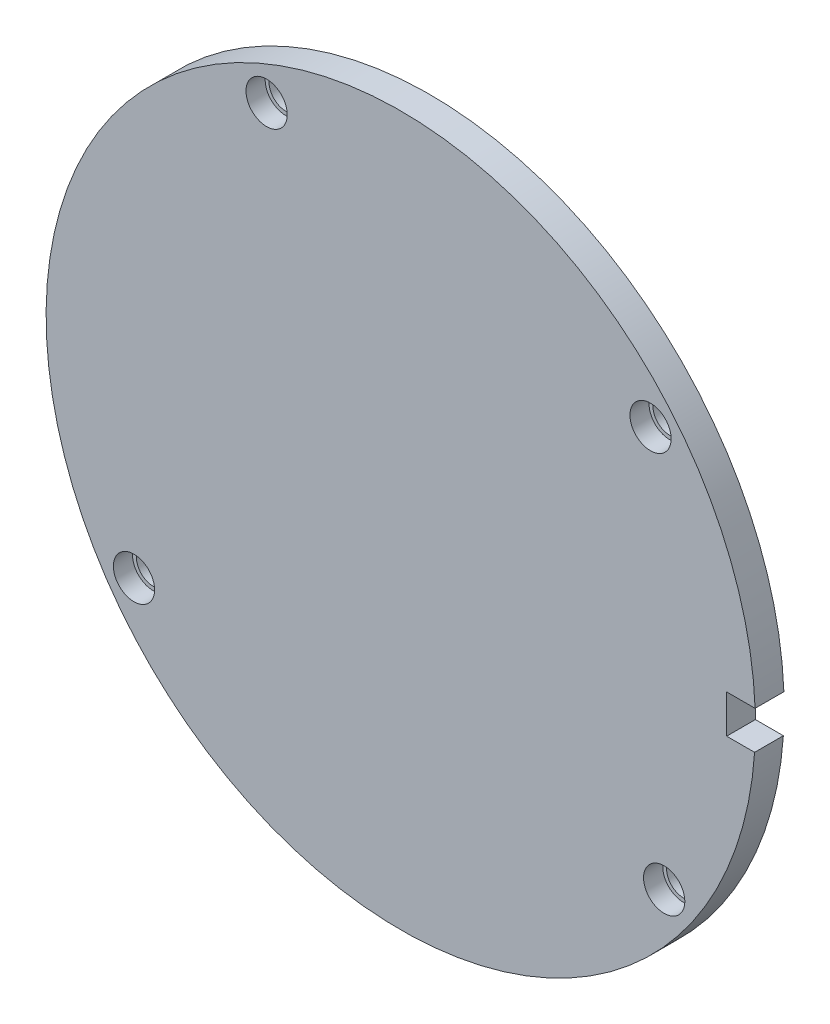
ISO-10303-21;
HEADER;
FILE_DESCRIPTION(('STEP AP214'),'2;1');
FILE_NAME('part.step','',(''),(''),'','','');
FILE_SCHEMA(('AUTOMOTIVE_DESIGN { 1 0 10303 214 1 1 1 1 }'));
ENDSEC;
DATA;
#1=APPLICATION_CONTEXT('core data for automotive mechanical design processes');
#2=APPLICATION_PROTOCOL_DEFINITION('international standard','automotive_design',2000,#1);
#3=PRODUCT_CONTEXT('',#1,'mechanical');
#4=PRODUCT('Part','Part','',(#3));
#5=PRODUCT_RELATED_PRODUCT_CATEGORY('part','',(#4));
#6=PRODUCT_DEFINITION_FORMATION('','',#4);
#7=PRODUCT_DEFINITION_CONTEXT('part definition',#1,'design');
#8=PRODUCT_DEFINITION('design','',#6,#7);
#9=PRODUCT_DEFINITION_SHAPE('','',#8);
#10=(LENGTH_UNIT() NAMED_UNIT(*) SI_UNIT(.MILLI.,.METRE.));
#11=(NAMED_UNIT(*) PLANE_ANGLE_UNIT() SI_UNIT($,.RADIAN.));
#12=(NAMED_UNIT(*) SI_UNIT($,.STERADIAN.) SOLID_ANGLE_UNIT());
#13=UNCERTAINTY_MEASURE_WITH_UNIT(LENGTH_MEASURE(1.E-05),#10,'distance_accuracy_value','');
#14=(GEOMETRIC_REPRESENTATION_CONTEXT(3) GLOBAL_UNCERTAINTY_ASSIGNED_CONTEXT((#13)) GLOBAL_UNIT_ASSIGNED_CONTEXT((#10,
#11,#12)) REPRESENTATION_CONTEXT('',''));
#15=CARTESIAN_POINT('',(0.,0.,0.));
#16=DIRECTION('',(0.,0.,1.));
#17=DIRECTION('',(1.,0.,0.));
#18=AXIS2_PLACEMENT_3D('',#15,#16,#17);
#19=CARTESIAN_POINT('',(0.,0.,-6.2));
#20=DIRECTION('',(0.,0.,1.));
#21=DIRECTION('',(1.,0.,0.));
#22=AXIS2_PLACEMENT_3D('',#19,#20,#21);
#23=CYLINDRICAL_SURFACE('',#22,18.5);
#24=CARTESIAN_POINT('',(0.,0.,0.));
#25=DIRECTION('',(0.,0.,-1.));
#26=DIRECTION('',(-1.,0.,0.));
#27=AXIS2_PLACEMENT_3D('',#24,#25,#26);
#28=CIRCLE('',#27,18.5);
#29=CARTESIAN_POINT('',(18.4578220201208,-1.24852163519195,0.));
#30=VERTEX_POINT('',#29);
#31=CARTESIAN_POINT('',(18.4847310033775,0.751478364808046,0.));
#32=VERTEX_POINT('',#31);
#33=EDGE_CURVE('E52',#30,#32,#28,.T.);
#34=ORIENTED_EDGE('',*,*,#33,.T.);
#35=DIRECTION('',(0.,0.,1.));
#36=VECTOR('',#35,1.);
#37=CARTESIAN_POINT('',(18.4847310033775,0.751478364808046,-6.2));
#38=LINE('',#37,#36);
#39=CARTESIAN_POINT('',(18.4847310033775,0.751478364808046,-1.5));
#40=VERTEX_POINT('',#39);
#41=EDGE_CURVE('E66',#32,#40,#38,.F.);
#42=ORIENTED_EDGE('',*,*,#41,.T.);
#43=CARTESIAN_POINT('',(0.,0.,-1.5));
#44=DIRECTION('',(0.,0.,-1.));
#45=DIRECTION('',(-1.,0.,0.));
#46=AXIS2_PLACEMENT_3D('',#43,#44,#45);
#47=CIRCLE('',#46,18.5);
#48=CARTESIAN_POINT('',(18.4578220201208,-1.24852163519195,-1.5));
#49=VERTEX_POINT('',#48);
#50=EDGE_CURVE('E149',#49,#40,#47,.T.);
#51=ORIENTED_EDGE('',*,*,#50,.F.);
#52=DIRECTION('',(0.,0.,1.));
#53=VECTOR('',#52,1.);
#54=CARTESIAN_POINT('',(18.4578220201208,-1.24852163519195,-6.2));
#55=LINE('',#54,#53);
#56=EDGE_CURVE('E58',#49,#30,#55,.T.);
#57=ORIENTED_EDGE('',*,*,#56,.T.);
#58=EDGE_LOOP('',(#34,#42,#51,#57));
#59=FACE_BOUND('',#58,.T.);
#60=ADVANCED_FACE('F45',(#59),#23,.T.);
#61=CARTESIAN_POINT('',(13.0293023175447,10.7348628830565,-6.2));
#62=DIRECTION('',(0.,0.,1.));
#63=DIRECTION('',(1.,0.,0.));
#64=AXIS2_PLACEMENT_3D('',#61,#62,#63);
#65=CYLINDRICAL_SURFACE('',#64,0.875);
#66=CARTESIAN_POINT('',(13.0293023175447,10.7348628830565,-1.));
#67=DIRECTION('',(0.,0.,-1.));
#68=DIRECTION('',(-1.,0.,0.));
#69=AXIS2_PLACEMENT_3D('',#66,#67,#68);
#70=CIRCLE('',#69,0.875);
#71=CARTESIAN_POINT('',(12.1543023175447,10.7348628830565,-1.));
#72=VERTEX_POINT('',#71);
#73=EDGE_CURVE('E155',#72,#72,#70,.T.);
#74=ORIENTED_EDGE('',*,*,#73,.F.);
#75=EDGE_LOOP('',(#74));
#76=FACE_BOUND('',#75,.T.);
#77=CARTESIAN_POINT('',(13.0293023175447,10.7348628830565,-1.5));
#78=DIRECTION('',(0.,0.,-1.));
#79=DIRECTION('',(-1.,0.,0.));
#80=AXIS2_PLACEMENT_3D('',#77,#78,#79);
#81=CIRCLE('',#80,0.875);
#82=CARTESIAN_POINT('',(12.1543023175447,10.7348628830565,-1.5));
#83=VERTEX_POINT('',#82);
#84=EDGE_CURVE('E146',#83,#83,#81,.T.);
#85=ORIENTED_EDGE('',*,*,#84,.T.);
#86=EDGE_LOOP('',(#85));
#87=FACE_BOUND('',#86,.T.);
#88=ADVANCED_FACE('F169',(#76,#87),#65,.F.);
#89=CARTESIAN_POINT('',(-6.99684971623732,15.3637265677436,-6.2));
#90=DIRECTION('',(0.,0.,1.));
#91=DIRECTION('',(1.,0.,0.));
#92=AXIS2_PLACEMENT_3D('',#89,#90,#91);
#93=CYLINDRICAL_SURFACE('',#92,0.874999999999999);
#94=CARTESIAN_POINT('',(-6.99684971623732,15.3637265677436,-1.));
#95=DIRECTION('',(0.,0.,-1.));
#96=DIRECTION('',(-1.,0.,0.));
#97=AXIS2_PLACEMENT_3D('',#94,#95,#96);
#98=CIRCLE('',#97,0.874999999999999);
#99=CARTESIAN_POINT('',(-7.87184971623732,15.3637265677436,-1.));
#100=VERTEX_POINT('',#99);
#101=EDGE_CURVE('E161',#100,#100,#98,.T.);
#102=ORIENTED_EDGE('',*,*,#101,.F.);
#103=EDGE_LOOP('',(#102));
#104=FACE_BOUND('',#103,.T.);
#105=CARTESIAN_POINT('',(-6.99684971623732,15.3637265677436,-1.5));
#106=DIRECTION('',(0.,0.,-1.));
#107=DIRECTION('',(-1.,0.,0.));
#108=AXIS2_PLACEMENT_3D('',#105,#106,#107);
#109=CIRCLE('',#108,0.874999999999999);
#110=CARTESIAN_POINT('',(-7.87184971623732,15.3637265677436,-1.5));
#111=VERTEX_POINT('',#110);
#112=EDGE_CURVE('E142',#111,#111,#109,.T.);
#113=ORIENTED_EDGE('',*,*,#112,.T.);
#114=EDGE_LOOP('',(#113));
#115=FACE_BOUND('',#114,.T.);
#116=ADVANCED_FACE('F172',(#104,#115),#93,.F.);
#117=CARTESIAN_POINT('',(13.7413128845952,-9.80695264634526,-6.2));
#118=DIRECTION('',(0.,0.,1.));
#119=DIRECTION('',(1.,0.,0.));
#120=AXIS2_PLACEMENT_3D('',#117,#118,#119);
#121=CYLINDRICAL_SURFACE('',#120,0.875);
#122=CARTESIAN_POINT('',(13.7413128845952,-9.80695264634526,-1.));
#123=DIRECTION('',(0.,0.,-1.));
#124=DIRECTION('',(-1.,0.,0.));
#125=AXIS2_PLACEMENT_3D('',#122,#123,#124);
#126=CIRCLE('',#125,0.875);
#127=CARTESIAN_POINT('',(12.8663128845952,-9.80695264634526,-1.));
#128=VERTEX_POINT('',#127);
#129=EDGE_CURVE('E158',#128,#128,#126,.T.);
#130=ORIENTED_EDGE('',*,*,#129,.F.);
#131=EDGE_LOOP('',(#130));
#132=FACE_BOUND('',#131,.T.);
#133=CARTESIAN_POINT('',(13.7413128845952,-9.80695264634526,-1.5));
#134=DIRECTION('',(0.,0.,-1.));
#135=DIRECTION('',(-1.,0.,0.));
#136=AXIS2_PLACEMENT_3D('',#133,#134,#135);
#137=CIRCLE('',#136,0.875);
#138=CARTESIAN_POINT('',(12.8663128845952,-9.80695264634526,-1.5));
#139=VERTEX_POINT('',#138);
#140=EDGE_CURVE('E139',#139,#139,#137,.T.);
#141=ORIENTED_EDGE('',*,*,#140,.T.);
#142=EDGE_LOOP('',(#141));
#143=FACE_BOUND('',#142,.T.);
#144=ADVANCED_FACE('F240',(#132,#143),#121,.F.);
#145=CARTESIAN_POINT('',(-13.9153268364395,-9.55843496787351,-6.2));
#146=DIRECTION('',(0.,0.,1.));
#147=DIRECTION('',(1.,0.,0.));
#148=AXIS2_PLACEMENT_3D('',#145,#146,#147);
#149=CYLINDRICAL_SURFACE('',#148,0.875);
#150=CARTESIAN_POINT('',(-13.9153268364395,-9.55843496787351,-1.));
#151=DIRECTION('',(0.,0.,-1.));
#152=DIRECTION('',(-1.,0.,0.));
#153=AXIS2_PLACEMENT_3D('',#150,#151,#152);
#154=CIRCLE('',#153,0.875);
#155=CARTESIAN_POINT('',(-14.7903268364395,-9.55843496787351,-1.));
#156=VERTEX_POINT('',#155);
#157=EDGE_CURVE('E118',#156,#156,#154,.T.);
#158=ORIENTED_EDGE('',*,*,#157,.F.);
#159=EDGE_LOOP('',(#158));
#160=FACE_BOUND('',#159,.T.);
#161=CARTESIAN_POINT('',(-13.9153268364395,-9.55843496787351,-1.5));
#162=DIRECTION('',(0.,0.,-1.));
#163=DIRECTION('',(-1.,0.,0.));
#164=AXIS2_PLACEMENT_3D('',#161,#162,#163);
#165=CIRCLE('',#164,0.875);
#166=CARTESIAN_POINT('',(-14.7903268364395,-9.55843496787351,-1.5));
#167=VERTEX_POINT('',#166);
#168=EDGE_CURVE('E143',#167,#167,#165,.T.);
#169=ORIENTED_EDGE('',*,*,#168,.T.);
#170=EDGE_LOOP('',(#169));
#171=FACE_BOUND('',#170,.T.);
#172=ADVANCED_FACE('F187',(#160,#171),#149,.F.);
#173=CARTESIAN_POINT('',(0.,0.,0.));
#174=DIRECTION('',(0.,0.,-1.));
#175=DIRECTION('',(-1.,0.,0.));
#176=AXIS2_PLACEMENT_3D('',#173,#174,#175);
#177=PLANE('',#176);
#178=CARTESIAN_POINT('',(-13.9153268364395,-9.55843496787351,0.));
#179=DIRECTION('',(0.,0.,-1.));
#180=DIRECTION('',(-1.,0.,0.));
#181=AXIS2_PLACEMENT_3D('',#178,#179,#180);
#182=CIRCLE('',#181,1.075);
#183=CARTESIAN_POINT('',(-14.9903268364395,-9.55843496787351,0.));
#184=VERTEX_POINT('',#183);
#185=EDGE_CURVE('E119',#184,#184,#182,.T.);
#186=ORIENTED_EDGE('',*,*,#185,.T.);
#187=EDGE_LOOP('',(#186));
#188=FACE_BOUND('',#187,.T.);
#189=CARTESIAN_POINT('',(13.7413128845952,-9.80695264634526,0.));
#190=DIRECTION('',(0.,0.,-1.));
#191=DIRECTION('',(-1.,0.,0.));
#192=AXIS2_PLACEMENT_3D('',#189,#190,#191);
#193=CIRCLE('',#192,1.075);
#194=CARTESIAN_POINT('',(12.6663128845952,-9.80695264634526,0.));
#195=VERTEX_POINT('',#194);
#196=EDGE_CURVE('E122',#195,#195,#193,.T.);
#197=ORIENTED_EDGE('',*,*,#196,.T.);
#198=EDGE_LOOP('',(#197));
#199=FACE_BOUND('',#198,.T.);
#200=CARTESIAN_POINT('',(13.0293023175447,10.7348628830565,0.));
#201=DIRECTION('',(0.,0.,-1.));
#202=DIRECTION('',(-1.,0.,0.));
#203=AXIS2_PLACEMENT_3D('',#200,#201,#202);
#204=CIRCLE('',#203,1.075);
#205=CARTESIAN_POINT('',(11.9543023175447,10.7348628830565,0.));
#206=VERTEX_POINT('',#205);
#207=EDGE_CURVE('E128',#206,#206,#204,.T.);
#208=ORIENTED_EDGE('',*,*,#207,.T.);
#209=EDGE_LOOP('',(#208));
#210=FACE_BOUND('',#209,.T.);
#211=CARTESIAN_POINT('',(-6.99684971623732,15.3637265677436,0.));
#212=DIRECTION('',(0.,0.,-1.));
#213=DIRECTION('',(-1.,0.,0.));
#214=AXIS2_PLACEMENT_3D('',#211,#212,#213);
#215=CIRCLE('',#214,1.075);
#216=CARTESIAN_POINT('',(-8.07184971623732,15.3637265677436,0.));
#217=VERTEX_POINT('',#216);
#218=EDGE_CURVE('E134',#217,#217,#215,.T.);
#219=ORIENTED_EDGE('',*,*,#218,.T.);
#220=EDGE_LOOP('',(#219));
#221=FACE_BOUND('',#220,.T.);
#222=DIRECTION('',(0.,1.,0.));
#223=VECTOR('',#222,1.);
#224=CARTESIAN_POINT('',(17.,0.,0.));
#225=LINE('',#224,#223);
#226=CARTESIAN_POINT('',(17.,-1.24852163519195,0.));
#227=VERTEX_POINT('',#226);
#228=CARTESIAN_POINT('',(17.,0.751478364808046,0.));
#229=VERTEX_POINT('',#228);
#230=EDGE_CURVE('E92',#227,#229,#225,.T.);
#231=ORIENTED_EDGE('',*,*,#230,.T.);
#232=DIRECTION('',(1.,0.,0.));
#233=VECTOR('',#232,1.);
#234=CARTESIAN_POINT('',(0.,0.751478364808045,0.));
#235=LINE('',#234,#233);
#236=EDGE_CURVE('E111',#229,#32,#235,.T.);
#237=ORIENTED_EDGE('',*,*,#236,.T.);
#238=ORIENTED_EDGE('',*,*,#33,.F.);
#239=DIRECTION('',(-1.,0.,0.));
#240=VECTOR('',#239,1.);
#241=CARTESIAN_POINT('',(0.,-1.24852163519195,0.));
#242=LINE('',#241,#240);
#243=EDGE_CURVE('E106',#30,#227,#242,.T.);
#244=ORIENTED_EDGE('',*,*,#243,.T.);
#245=EDGE_LOOP('',(#231,#237,#238,#244));
#246=FACE_BOUND('',#245,.T.);
#247=ADVANCED_FACE('F177',(#188,#199,#210,#221,#246),#177,.F.);
#248=CARTESIAN_POINT('',(0.,0.,-1.5));
#249=DIRECTION('',(0.,0.,-1.));
#250=DIRECTION('',(-1.,0.,0.));
#251=AXIS2_PLACEMENT_3D('',#248,#249,#250);
#252=PLANE('',#251);
#253=DIRECTION('',(1.,0.,0.));
#254=VECTOR('',#253,1.);
#255=CARTESIAN_POINT('',(21.6470470626813,0.751478364808046,-1.5));
#256=LINE('',#255,#254);
#257=CARTESIAN_POINT('',(17.,0.751478364808046,-1.5));
#258=VERTEX_POINT('',#257);
#259=EDGE_CURVE('E95',#258,#40,#256,.T.);
#260=ORIENTED_EDGE('',*,*,#259,.F.);
#261=DIRECTION('',(0.,1.,0.));
#262=VECTOR('',#261,1.);
#263=CARTESIAN_POINT('',(17.,0.751478364808046,-1.5));
#264=LINE('',#263,#262);
#265=CARTESIAN_POINT('',(17.,-1.24852163519195,-1.5));
#266=VERTEX_POINT('',#265);
#267=EDGE_CURVE('E89',#266,#258,#264,.T.);
#268=ORIENTED_EDGE('',*,*,#267,.F.);
#269=DIRECTION('',(-1.,0.,0.));
#270=VECTOR('',#269,1.);
#271=CARTESIAN_POINT('',(0.,-1.24852163519195,-1.5));
#272=LINE('',#271,#270);
#273=EDGE_CURVE('E12',#49,#266,#272,.T.);
#274=ORIENTED_EDGE('',*,*,#273,.F.);
#275=ORIENTED_EDGE('',*,*,#50,.T.);
#276=EDGE_LOOP('',(#260,#268,#274,#275));
#277=FACE_BOUND('',#276,.T.);
#278=ORIENTED_EDGE('',*,*,#168,.F.);
#279=EDGE_LOOP('',(#278));
#280=FACE_BOUND('',#279,.T.);
#281=ORIENTED_EDGE('',*,*,#140,.F.);
#282=EDGE_LOOP('',(#281));
#283=FACE_BOUND('',#282,.T.);
#284=ORIENTED_EDGE('',*,*,#112,.F.);
#285=EDGE_LOOP('',(#284));
#286=FACE_BOUND('',#285,.T.);
#287=ORIENTED_EDGE('',*,*,#84,.F.);
#288=EDGE_LOOP('',(#287));
#289=FACE_BOUND('',#288,.T.);
#290=ADVANCED_FACE('F101',(#277,#280,#283,#286,#289),#252,.T.);
#291=CARTESIAN_POINT('',(-6.99684971623732,15.3637265677436,-1.));
#292=DIRECTION('',(0.,0.,1.));
#293=DIRECTION('',(1.,0.,0.));
#294=AXIS2_PLACEMENT_3D('',#291,#292,#293);
#295=CYLINDRICAL_SURFACE('',#294,1.075);
#296=CARTESIAN_POINT('',(-6.99684971623732,15.3637265677436,-1.));
#297=DIRECTION('',(0.,0.,-1.));
#298=DIRECTION('',(-1.,0.,0.));
#299=AXIS2_PLACEMENT_3D('',#296,#297,#298);
#300=CIRCLE('',#299,1.075);
#301=CARTESIAN_POINT('',(-8.07184971623732,15.3637265677436,-1.));
#302=VERTEX_POINT('',#301);
#303=EDGE_CURVE('E114',#302,#302,#300,.T.);
#304=ORIENTED_EDGE('',*,*,#303,.T.);
#305=EDGE_LOOP('',(#304));
#306=FACE_BOUND('',#305,.T.);
#307=ORIENTED_EDGE('',*,*,#218,.F.);
#308=EDGE_LOOP('',(#307));
#309=FACE_BOUND('',#308,.T.);
#310=ADVANCED_FACE('F176',(#306,#309),#295,.F.);
#311=CARTESIAN_POINT('',(-6.99684971623732,15.3637265677436,-1.));
#312=DIRECTION('',(0.,0.,-1.));
#313=DIRECTION('',(-1.,0.,0.));
#314=AXIS2_PLACEMENT_3D('',#311,#312,#313);
#315=PLANE('',#314);
#316=ORIENTED_EDGE('',*,*,#101,.T.);
#317=EDGE_LOOP('',(#316));
#318=FACE_BOUND('',#317,.T.);
#319=ORIENTED_EDGE('',*,*,#303,.F.);
#320=EDGE_LOOP('',(#319));
#321=FACE_BOUND('',#320,.T.);
#322=ADVANCED_FACE('F184',(#318,#321),#315,.F.);
#323=CARTESIAN_POINT('',(13.0293023175447,10.7348628830565,-1.));
#324=DIRECTION('',(0.,0.,1.));
#325=DIRECTION('',(1.,0.,0.));
#326=AXIS2_PLACEMENT_3D('',#323,#324,#325);
#327=CYLINDRICAL_SURFACE('',#326,1.075);
#328=CARTESIAN_POINT('',(13.0293023175447,10.7348628830565,-1.));
#329=DIRECTION('',(0.,0.,-1.));
#330=DIRECTION('',(-1.,0.,0.));
#331=AXIS2_PLACEMENT_3D('',#328,#329,#330);
#332=CIRCLE('',#331,1.075);
#333=CARTESIAN_POINT('',(11.9543023175447,10.7348628830565,-1.));
#334=VERTEX_POINT('',#333);
#335=EDGE_CURVE('E131',#334,#334,#332,.T.);
#336=ORIENTED_EDGE('',*,*,#335,.T.);
#337=EDGE_LOOP('',(#336));
#338=FACE_BOUND('',#337,.T.);
#339=ORIENTED_EDGE('',*,*,#207,.F.);
#340=EDGE_LOOP('',(#339));
#341=FACE_BOUND('',#340,.T.);
#342=ADVANCED_FACE('F222',(#338,#341),#327,.F.);
#343=CARTESIAN_POINT('',(13.0293023175447,10.7348628830565,-1.));
#344=DIRECTION('',(0.,0.,-1.));
#345=DIRECTION('',(-1.,0.,0.));
#346=AXIS2_PLACEMENT_3D('',#343,#344,#345);
#347=PLANE('',#346);
#348=ORIENTED_EDGE('',*,*,#73,.T.);
#349=EDGE_LOOP('',(#348));
#350=FACE_BOUND('',#349,.T.);
#351=ORIENTED_EDGE('',*,*,#335,.F.);
#352=EDGE_LOOP('',(#351));
#353=FACE_BOUND('',#352,.T.);
#354=ADVANCED_FACE('F166',(#350,#353),#347,.F.);
#355=CARTESIAN_POINT('',(13.7413128845952,-9.80695264634526,-1.));
#356=DIRECTION('',(0.,0.,1.));
#357=DIRECTION('',(1.,0.,0.));
#358=AXIS2_PLACEMENT_3D('',#355,#356,#357);
#359=CYLINDRICAL_SURFACE('',#358,1.075);
#360=CARTESIAN_POINT('',(13.7413128845952,-9.80695264634526,-1.));
#361=DIRECTION('',(0.,0.,-1.));
#362=DIRECTION('',(-1.,0.,0.));
#363=AXIS2_PLACEMENT_3D('',#360,#361,#362);
#364=CIRCLE('',#363,1.075);
#365=CARTESIAN_POINT('',(12.6663128845952,-9.80695264634526,-1.));
#366=VERTEX_POINT('',#365);
#367=EDGE_CURVE('E125',#366,#366,#364,.T.);
#368=ORIENTED_EDGE('',*,*,#367,.T.);
#369=EDGE_LOOP('',(#368));
#370=FACE_BOUND('',#369,.T.);
#371=ORIENTED_EDGE('',*,*,#196,.F.);
#372=EDGE_LOOP('',(#371));
#373=FACE_BOUND('',#372,.T.);
#374=ADVANCED_FACE('F215',(#370,#373),#359,.F.);
#375=CARTESIAN_POINT('',(13.7413128845952,-9.80695264634526,-1.));
#376=DIRECTION('',(0.,0.,-1.));
#377=DIRECTION('',(-1.,0.,0.));
#378=AXIS2_PLACEMENT_3D('',#375,#376,#377);
#379=PLANE('',#378);
#380=ORIENTED_EDGE('',*,*,#129,.T.);
#381=EDGE_LOOP('',(#380));
#382=FACE_BOUND('',#381,.T.);
#383=ORIENTED_EDGE('',*,*,#367,.F.);
#384=EDGE_LOOP('',(#383));
#385=FACE_BOUND('',#384,.T.);
#386=ADVANCED_FACE('F213',(#382,#385),#379,.F.);
#387=CARTESIAN_POINT('',(-13.9153268364395,-9.55843496787351,-1.));
#388=DIRECTION('',(0.,0.,1.));
#389=DIRECTION('',(1.,0.,0.));
#390=AXIS2_PLACEMENT_3D('',#387,#388,#389);
#391=CYLINDRICAL_SURFACE('',#390,1.075);
#392=CARTESIAN_POINT('',(-13.9153268364395,-9.55843496787351,-1.));
#393=DIRECTION('',(0.,0.,-1.));
#394=DIRECTION('',(-1.,0.,0.));
#395=AXIS2_PLACEMENT_3D('',#392,#393,#394);
#396=CIRCLE('',#395,1.075);
#397=CARTESIAN_POINT('',(-14.9903268364395,-9.55843496787351,-1.));
#398=VERTEX_POINT('',#397);
#399=EDGE_CURVE('E115',#398,#398,#396,.T.);
#400=ORIENTED_EDGE('',*,*,#399,.T.);
#401=EDGE_LOOP('',(#400));
#402=FACE_BOUND('',#401,.T.);
#403=ORIENTED_EDGE('',*,*,#185,.F.);
#404=EDGE_LOOP('',(#403));
#405=FACE_BOUND('',#404,.T.);
#406=ADVANCED_FACE('F205',(#402,#405),#391,.F.);
#407=CARTESIAN_POINT('',(-13.9153268364395,-9.55843496787351,-1.));
#408=DIRECTION('',(0.,0.,-1.));
#409=DIRECTION('',(-1.,0.,0.));
#410=AXIS2_PLACEMENT_3D('',#407,#408,#409);
#411=PLANE('',#410);
#412=ORIENTED_EDGE('',*,*,#157,.T.);
#413=EDGE_LOOP('',(#412));
#414=FACE_BOUND('',#413,.T.);
#415=ORIENTED_EDGE('',*,*,#399,.F.);
#416=EDGE_LOOP('',(#415));
#417=FACE_BOUND('',#416,.T.);
#418=ADVANCED_FACE('F199',(#414,#417),#411,.F.);
#419=CARTESIAN_POINT('',(21.6470470626813,0.751478364808046,8.5));
#420=DIRECTION('',(0.,1.,0.));
#421=DIRECTION('',(-1.,0.,0.));
#422=AXIS2_PLACEMENT_3D('',#419,#420,#421);
#423=PLANE('',#422);
#424=ORIENTED_EDGE('',*,*,#236,.F.);
#425=DIRECTION('',(0.,0.,-1.));
#426=VECTOR('',#425,1.);
#427=CARTESIAN_POINT('',(17.,0.751478364808046,8.5));
#428=LINE('',#427,#426);
#429=EDGE_CURVE('E94',#229,#258,#428,.T.);
#430=ORIENTED_EDGE('',*,*,#429,.T.);
#431=ORIENTED_EDGE('',*,*,#259,.T.);
#432=ORIENTED_EDGE('',*,*,#41,.F.);
#433=EDGE_LOOP('',(#424,#430,#431,#432));
#434=FACE_BOUND('',#433,.T.);
#435=ADVANCED_FACE('F198',(#434),#423,.F.);
#436=CARTESIAN_POINT('',(17.,0.751478364808046,8.5));
#437=DIRECTION('',(-1.,0.,0.));
#438=DIRECTION('',(0.,0.,1.));
#439=AXIS2_PLACEMENT_3D('',#436,#437,#438);
#440=PLANE('',#439);
#441=DIRECTION('',(0.,0.,-1.));
#442=VECTOR('',#441,1.);
#443=CARTESIAN_POINT('',(17.,-1.24852163519195,8.5));
#444=LINE('',#443,#442);
#445=EDGE_CURVE('E85',#227,#266,#444,.T.);
#446=ORIENTED_EDGE('',*,*,#445,.T.);
#447=ORIENTED_EDGE('',*,*,#267,.T.);
#448=ORIENTED_EDGE('',*,*,#429,.F.);
#449=ORIENTED_EDGE('',*,*,#230,.F.);
#450=EDGE_LOOP('',(#446,#447,#448,#449));
#451=FACE_BOUND('',#450,.T.);
#452=ADVANCED_FACE('F86',(#451),#440,.F.);
#453=CARTESIAN_POINT('',(21.6470470626813,-1.24852163519195,8.5));
#454=DIRECTION('',(0.,-1.,0.));
#455=DIRECTION('',(0.,0.,-1.));
#456=AXIS2_PLACEMENT_3D('',#453,#454,#455);
#457=PLANE('',#456);
#458=ORIENTED_EDGE('',*,*,#273,.T.);
#459=ORIENTED_EDGE('',*,*,#445,.F.);
#460=ORIENTED_EDGE('',*,*,#243,.F.);
#461=ORIENTED_EDGE('',*,*,#56,.F.);
#462=EDGE_LOOP('',(#458,#459,#460,#461));
#463=FACE_BOUND('',#462,.T.);
#464=ADVANCED_FACE('F97',(#463),#457,.F.);
#465=CLOSED_SHELL('',(#60,#88,#116,#144,#172,#247,#290,#310,#322,#342,#354,#374,#386,#406,#418,
#435,#452,#464));
#466=MANIFOLD_SOLID_BREP('B2',#465);
#467=ADVANCED_BREP_SHAPE_REPRESENTATION('',(#18,#466),#14);
#468=SHAPE_DEFINITION_REPRESENTATION(#9,#467);
ENDSEC;
END-ISO-10303-21;
